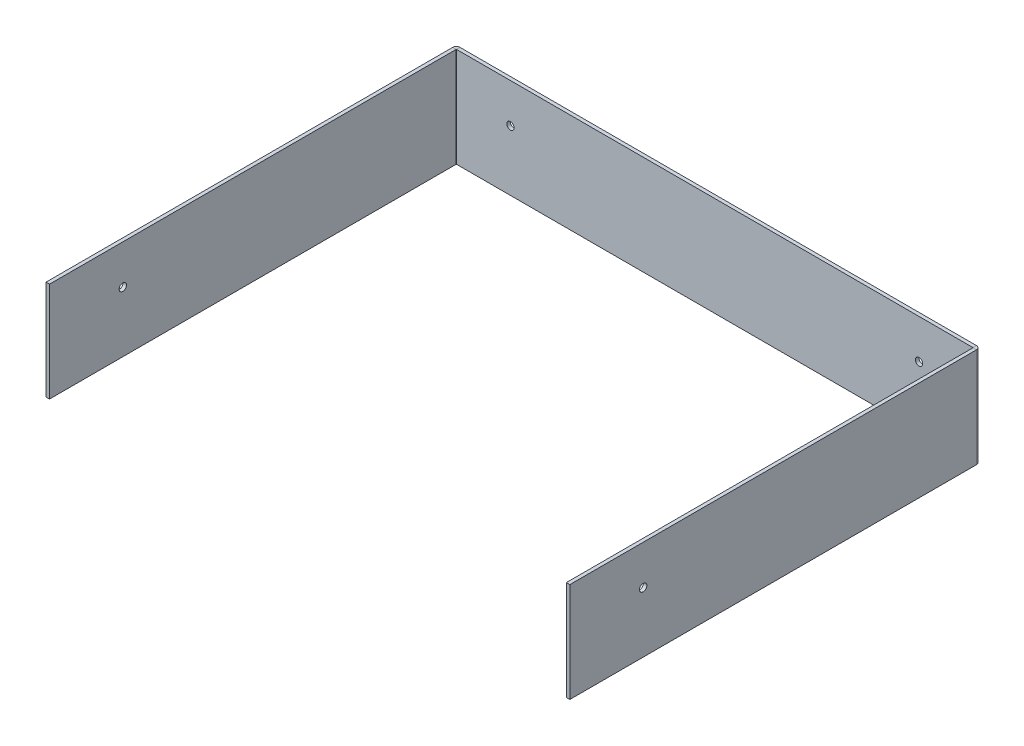
ISO-10303-21;
HEADER;
FILE_DESCRIPTION(('STEP AP214'),'2;1');
FILE_NAME('part.step','',(''),(''),'','','');
FILE_SCHEMA(('AUTOMOTIVE_DESIGN { 1 0 10303 214 1 1 1 1 }'));
ENDSEC;
DATA;
#1=APPLICATION_CONTEXT('core data for automotive mechanical design processes');
#2=APPLICATION_PROTOCOL_DEFINITION('international standard','automotive_design',2000,#1);
#3=PRODUCT_CONTEXT('',#1,'mechanical');
#4=PRODUCT('Part','Part','',(#3));
#5=PRODUCT_RELATED_PRODUCT_CATEGORY('part','',(#4));
#6=PRODUCT_DEFINITION_FORMATION('','',#4);
#7=PRODUCT_DEFINITION_CONTEXT('part definition',#1,'design');
#8=PRODUCT_DEFINITION('design','',#6,#7);
#9=PRODUCT_DEFINITION_SHAPE('','',#8);
#10=(LENGTH_UNIT() NAMED_UNIT(*) SI_UNIT(.MILLI.,.METRE.));
#11=(NAMED_UNIT(*) PLANE_ANGLE_UNIT() SI_UNIT($,.RADIAN.));
#12=(NAMED_UNIT(*) SI_UNIT($,.STERADIAN.) SOLID_ANGLE_UNIT());
#13=UNCERTAINTY_MEASURE_WITH_UNIT(LENGTH_MEASURE(1.E-05),#10,'distance_accuracy_value','');
#14=(GEOMETRIC_REPRESENTATION_CONTEXT(3) GLOBAL_UNCERTAINTY_ASSIGNED_CONTEXT((#13)) GLOBAL_UNIT_ASSIGNED_CONTEXT((#10,
#11,#12)) REPRESENTATION_CONTEXT('',''));
#15=CARTESIAN_POINT('',(0.,0.,0.));
#16=DIRECTION('',(0.,0.,1.));
#17=DIRECTION('',(1.,0.,0.));
#18=AXIS2_PLACEMENT_3D('',#15,#16,#17);
#19=CARTESIAN_POINT('',(-150.,-28.5,-2.));
#20=DIRECTION('',(0.,0.,1.));
#21=DIRECTION('',(1.,0.,0.));
#22=AXIS2_PLACEMENT_3D('',#19,#20,#21);
#23=PLANE('',#22);
#24=CARTESIAN_POINT('',(117.,6.00000000000002,-2.));
#25=DIRECTION('',(0.,0.,1.));
#26=DIRECTION('',(1.,0.,0.));
#27=AXIS2_PLACEMENT_3D('',#24,#25,#26);
#28=CIRCLE('',#27,2.1);
#29=CARTESIAN_POINT('',(119.1,6.00000000000002,-2.));
#30=VERTEX_POINT('',#29);
#31=EDGE_CURVE('E291',#30,#30,#28,.T.);
#32=ORIENTED_EDGE('',*,*,#31,.T.);
#33=EDGE_LOOP('',(#32));
#34=FACE_BOUND('',#33,.T.);
#35=CARTESIAN_POINT('',(-117.,5.99999999999999,-2.));
#36=DIRECTION('',(0.,0.,1.));
#37=DIRECTION('',(1.,0.,0.));
#38=AXIS2_PLACEMENT_3D('',#35,#36,#37);
#39=CIRCLE('',#38,2.1);
#40=CARTESIAN_POINT('',(-114.9,5.99999999999999,-2.));
#41=VERTEX_POINT('',#40);
#42=EDGE_CURVE('E297',#41,#41,#39,.T.);
#43=ORIENTED_EDGE('',*,*,#42,.T.);
#44=EDGE_LOOP('',(#43));
#45=FACE_BOUND('',#44,.T.);
#46=DIRECTION('',(0.,1.,0.));
#47=VECTOR('',#46,1.);
#48=CARTESIAN_POINT('',(147.9,28.5,-2.));
#49=LINE('',#48,#47);
#50=CARTESIAN_POINT('',(147.9,28.5,-2.));
#51=VERTEX_POINT('',#50);
#52=CARTESIAN_POINT('',(147.9,-28.5,-2.));
#53=VERTEX_POINT('',#52);
#54=EDGE_CURVE('E180',#51,#53,#49,.F.);
#55=ORIENTED_EDGE('',*,*,#54,.T.);
#56=DIRECTION('',(1.,0.,0.));
#57=VECTOR('',#56,1.);
#58=CARTESIAN_POINT('',(-150.,-28.5,-2.));
#59=LINE('',#58,#57);
#60=CARTESIAN_POINT('',(-147.9,-28.5,-2.));
#61=VERTEX_POINT('',#60);
#62=EDGE_CURVE('E91',#61,#53,#59,.T.);
#63=ORIENTED_EDGE('',*,*,#62,.F.);
#64=DIRECTION('',(0.,-1.,0.));
#65=VECTOR('',#64,1.);
#66=CARTESIAN_POINT('',(-147.9,-28.5,-2.));
#67=LINE('',#66,#65);
#68=CARTESIAN_POINT('',(-147.9,28.5,-2.));
#69=VERTEX_POINT('',#68);
#70=EDGE_CURVE('E270',#61,#69,#67,.F.);
#71=ORIENTED_EDGE('',*,*,#70,.T.);
#72=DIRECTION('',(-1.,0.,0.));
#73=VECTOR('',#72,1.);
#74=CARTESIAN_POINT('',(-150.,28.5,-2.));
#75=LINE('',#74,#73);
#76=EDGE_CURVE('E13',#51,#69,#75,.T.);
#77=ORIENTED_EDGE('',*,*,#76,.F.);
#78=EDGE_LOOP('',(#55,#63,#71,#77));
#79=FACE_BOUND('',#78,.T.);
#80=ADVANCED_FACE('F82',(#34,#45,#79),#23,.F.);
#81=CARTESIAN_POINT('',(-150.,-28.5,0.));
#82=DIRECTION('',(0.,0.,1.));
#83=DIRECTION('',(1.,0.,0.));
#84=AXIS2_PLACEMENT_3D('',#81,#82,#83);
#85=PLANE('',#84);
#86=CARTESIAN_POINT('',(117.,6.00000000000002,0.));
#87=DIRECTION('',(0.,0.,1.));
#88=DIRECTION('',(1.,0.,0.));
#89=AXIS2_PLACEMENT_3D('',#86,#87,#88);
#90=CIRCLE('',#89,2.1);
#91=CARTESIAN_POINT('',(119.1,6.00000000000002,0.));
#92=VERTEX_POINT('',#91);
#93=EDGE_CURVE('E288',#92,#92,#90,.T.);
#94=ORIENTED_EDGE('',*,*,#93,.F.);
#95=EDGE_LOOP('',(#94));
#96=FACE_BOUND('',#95,.T.);
#97=CARTESIAN_POINT('',(-117.,5.99999999999999,0.));
#98=DIRECTION('',(0.,0.,1.));
#99=DIRECTION('',(1.,0.,0.));
#100=AXIS2_PLACEMENT_3D('',#97,#98,#99);
#101=CIRCLE('',#100,2.1);
#102=CARTESIAN_POINT('',(-114.9,5.99999999999999,0.));
#103=VERTEX_POINT('',#102);
#104=EDGE_CURVE('E294',#103,#103,#101,.T.);
#105=ORIENTED_EDGE('',*,*,#104,.F.);
#106=EDGE_LOOP('',(#105));
#107=FACE_BOUND('',#106,.T.);
#108=DIRECTION('',(1.,0.,0.));
#109=VECTOR('',#108,1.);
#110=CARTESIAN_POINT('',(-150.,-28.5,0.));
#111=LINE('',#110,#109);
#112=CARTESIAN_POINT('',(-147.9,-28.5,0.));
#113=VERTEX_POINT('',#112);
#114=CARTESIAN_POINT('',(147.9,-28.5,0.));
#115=VERTEX_POINT('',#114);
#116=EDGE_CURVE('E300',#113,#115,#111,.T.);
#117=ORIENTED_EDGE('',*,*,#116,.T.);
#118=DIRECTION('',(0.,1.,0.));
#119=VECTOR('',#118,1.);
#120=CARTESIAN_POINT('',(147.9,28.5,0.));
#121=LINE('',#120,#119);
#122=CARTESIAN_POINT('',(147.9,28.5,0.));
#123=VERTEX_POINT('',#122);
#124=EDGE_CURVE('E231',#123,#115,#121,.F.);
#125=ORIENTED_EDGE('',*,*,#124,.F.);
#126=DIRECTION('',(-1.,0.,0.));
#127=VECTOR('',#126,1.);
#128=CARTESIAN_POINT('',(-150.,28.5,0.));
#129=LINE('',#128,#127);
#130=CARTESIAN_POINT('',(-147.9,28.5,0.));
#131=VERTEX_POINT('',#130);
#132=EDGE_CURVE('E304',#123,#131,#129,.T.);
#133=ORIENTED_EDGE('',*,*,#132,.T.);
#134=DIRECTION('',(0.,-1.,0.));
#135=VECTOR('',#134,1.);
#136=CARTESIAN_POINT('',(-147.9,-28.5,0.));
#137=LINE('',#136,#135);
#138=EDGE_CURVE('E99',#113,#131,#137,.F.);
#139=ORIENTED_EDGE('',*,*,#138,.F.);
#140=EDGE_LOOP('',(#117,#125,#133,#139));
#141=FACE_BOUND('',#140,.T.);
#142=ADVANCED_FACE('F307',(#96,#107,#141),#85,.T.);
#143=CARTESIAN_POINT('',(-150.,28.5,-2.));
#144=DIRECTION('',(0.,1.,0.));
#145=DIRECTION('',(-1.,0.,0.));
#146=AXIS2_PLACEMENT_3D('',#143,#144,#145);
#147=PLANE('',#146);
#148=ORIENTED_EDGE('',*,*,#132,.F.);
#149=DIRECTION('',(0.,0.,-1.));
#150=VECTOR('',#149,1.);
#151=CARTESIAN_POINT('',(147.9,28.5,0.));
#152=LINE('',#151,#150);
#153=EDGE_CURVE('E227',#123,#51,#152,.T.);
#154=ORIENTED_EDGE('',*,*,#153,.T.);
#155=ORIENTED_EDGE('',*,*,#76,.T.);
#156=DIRECTION('',(0.,1.3877787807816E-13,-1.));
#157=VECTOR('',#156,1.);
#158=CARTESIAN_POINT('',(-147.9,28.5,0.));
#159=LINE('',#158,#157);
#160=EDGE_CURVE('E285',#131,#69,#159,.T.);
#161=ORIENTED_EDGE('',*,*,#160,.F.);
#162=EDGE_LOOP('',(#148,#154,#155,#161));
#163=FACE_BOUND('',#162,.T.);
#164=ADVANCED_FACE('F308',(#163),#147,.T.);
#165=CARTESIAN_POINT('',(-150.,-28.5,-2.));
#166=DIRECTION('',(0.,-1.,0.));
#167=DIRECTION('',(1.,0.,0.));
#168=AXIS2_PLACEMENT_3D('',#165,#166,#167);
#169=PLANE('',#168);
#170=DIRECTION('',(0.,-1.3877787807816E-13,-1.));
#171=VECTOR('',#170,1.);
#172=CARTESIAN_POINT('',(147.9,-28.5,0.));
#173=LINE('',#172,#171);
#174=EDGE_CURVE('E235',#115,#53,#173,.T.);
#175=ORIENTED_EDGE('',*,*,#174,.F.);
#176=ORIENTED_EDGE('',*,*,#116,.F.);
#177=DIRECTION('',(0.,0.,-1.));
#178=VECTOR('',#177,1.);
#179=CARTESIAN_POINT('',(-147.9,-28.5,0.));
#180=LINE('',#179,#178);
#181=EDGE_CURVE('E276',#113,#61,#180,.T.);
#182=ORIENTED_EDGE('',*,*,#181,.T.);
#183=ORIENTED_EDGE('',*,*,#62,.T.);
#184=EDGE_LOOP('',(#175,#176,#182,#183));
#185=FACE_BOUND('',#184,.T.);
#186=ADVANCED_FACE('F84',(#185),#169,.T.);
#187=CARTESIAN_POINT('',(-117.,5.99999999999999,-2.));
#188=DIRECTION('',(0.,0.,1.));
#189=DIRECTION('',(1.,0.,0.));
#190=AXIS2_PLACEMENT_3D('',#187,#188,#189);
#191=CYLINDRICAL_SURFACE('',#190,2.1);
#192=ORIENTED_EDGE('',*,*,#42,.F.);
#193=EDGE_LOOP('',(#192));
#194=FACE_BOUND('',#193,.T.);
#195=ORIENTED_EDGE('',*,*,#104,.T.);
#196=EDGE_LOOP('',(#195));
#197=FACE_BOUND('',#196,.T.);
#198=ADVANCED_FACE('F361',(#194,#197),#191,.F.);
#199=CARTESIAN_POINT('',(117.,6.00000000000002,-2.));
#200=DIRECTION('',(0.,0.,1.));
#201=DIRECTION('',(1.,0.,0.));
#202=AXIS2_PLACEMENT_3D('',#199,#200,#201);
#203=CYLINDRICAL_SURFACE('',#202,2.1);
#204=ORIENTED_EDGE('',*,*,#31,.F.);
#205=EDGE_LOOP('',(#204));
#206=FACE_BOUND('',#205,.T.);
#207=ORIENTED_EDGE('',*,*,#93,.T.);
#208=EDGE_LOOP('',(#207));
#209=FACE_BOUND('',#208,.T.);
#210=ADVANCED_FACE('F371',(#206,#209),#203,.F.);
#211=CARTESIAN_POINT('',(-147.9,28.5,0.0999999999999893));
#212=DIRECTION('',(0.,1.,0.));
#213=DIRECTION('',(0.,0.,1.));
#214=AXIS2_PLACEMENT_3D('',#211,#212,#213);
#215=PLANE('',#214);
#216=DIRECTION('',(1.,0.,0.));
#217=VECTOR('',#216,1.);
#218=CARTESIAN_POINT('',(-150.,28.5,0.099999999999982));
#219=LINE('',#218,#217);
#220=CARTESIAN_POINT('',(-148.,28.5,0.099999999999989));
#221=VERTEX_POINT('',#220);
#222=CARTESIAN_POINT('',(-150.,28.4999999999999,0.0999999999999821));
#223=VERTEX_POINT('',#222);
#224=EDGE_CURVE('E238',#221,#223,#219,.F.);
#225=ORIENTED_EDGE('',*,*,#224,.F.);
#226=CARTESIAN_POINT('',(-147.9,28.5,0.0999999999999893));
#227=DIRECTION('',(0.,-1.,0.));
#228=DIRECTION('',(0.,0.,-1.));
#229=AXIS2_PLACEMENT_3D('',#226,#227,#228);
#230=CIRCLE('',#229,0.099999999999989);
#231=EDGE_CURVE('E279',#131,#221,#230,.F.);
#232=ORIENTED_EDGE('',*,*,#231,.F.);
#233=ORIENTED_EDGE('',*,*,#160,.T.);
#234=CARTESIAN_POINT('',(-147.9,28.4999999999999,0.0999999999999893));
#235=DIRECTION('',(0.,-1.,0.));
#236=DIRECTION('',(0.,0.,-1.));
#237=AXIS2_PLACEMENT_3D('',#234,#235,#236);
#238=CIRCLE('',#237,2.09999999999999);
#239=EDGE_CURVE('E272',#69,#223,#238,.F.);
#240=ORIENTED_EDGE('',*,*,#239,.T.);
#241=EDGE_LOOP('',(#225,#232,#233,#240));
#242=FACE_BOUND('',#241,.T.);
#243=ADVANCED_FACE('F316',(#242),#215,.T.);
#244=CARTESIAN_POINT('',(-147.9,-28.5,0.0999999999999893));
#245=DIRECTION('',(0.,1.,0.));
#246=DIRECTION('',(0.,0.,1.));
#247=AXIS2_PLACEMENT_3D('',#244,#245,#246);
#248=PLANE('',#247);
#249=CARTESIAN_POINT('',(-147.9,-28.5,0.0999999999999893));
#250=DIRECTION('',(0.,-1.,0.));
#251=DIRECTION('',(0.,0.,-1.));
#252=AXIS2_PLACEMENT_3D('',#249,#250,#251);
#253=CIRCLE('',#252,0.099999999999989);
#254=CARTESIAN_POINT('',(-148.,-28.5,0.099999999999989));
#255=VERTEX_POINT('',#254);
#256=EDGE_CURVE('E243',#255,#113,#253,.T.);
#257=ORIENTED_EDGE('',*,*,#256,.F.);
#258=DIRECTION('',(1.,0.,0.));
#259=VECTOR('',#258,1.);
#260=CARTESIAN_POINT('',(-148.,-28.5,0.099999999999989));
#261=LINE('',#260,#259);
#262=CARTESIAN_POINT('',(-150.,-28.5,0.099999999999982));
#263=VERTEX_POINT('',#262);
#264=EDGE_CURVE('E263',#255,#263,#261,.F.);
#265=ORIENTED_EDGE('',*,*,#264,.T.);
#266=CARTESIAN_POINT('',(-147.9,-28.5,0.0999999999999893));
#267=DIRECTION('',(0.,-1.,0.));
#268=DIRECTION('',(0.,0.,-1.));
#269=AXIS2_PLACEMENT_3D('',#266,#267,#268);
#270=CIRCLE('',#269,2.09999999999999);
#271=EDGE_CURVE('E273',#263,#61,#270,.T.);
#272=ORIENTED_EDGE('',*,*,#271,.T.);
#273=ORIENTED_EDGE('',*,*,#181,.F.);
#274=EDGE_LOOP('',(#257,#265,#272,#273));
#275=FACE_BOUND('',#274,.T.);
#276=ADVANCED_FACE('F337',(#275),#248,.F.);
#277=CARTESIAN_POINT('',(-147.9,-28.5,0.0999999999999893));
#278=DIRECTION('',(0.,-1.,0.));
#279=DIRECTION('',(-1.,0.,0.));
#280=AXIS2_PLACEMENT_3D('',#277,#278,#279);
#281=CYLINDRICAL_SURFACE('',#280,2.09999999999999);
#282=ORIENTED_EDGE('',*,*,#70,.F.);
#283=ORIENTED_EDGE('',*,*,#271,.F.);
#284=DIRECTION('',(0.,-1.,0.));
#285=VECTOR('',#284,1.);
#286=CARTESIAN_POINT('',(-150.,28.5,0.099999999999982));
#287=LINE('',#286,#285);
#288=EDGE_CURVE('E261',#263,#223,#287,.F.);
#289=ORIENTED_EDGE('',*,*,#288,.T.);
#290=ORIENTED_EDGE('',*,*,#239,.F.);
#291=EDGE_LOOP('',(#282,#283,#289,#290));
#292=FACE_BOUND('',#291,.T.);
#293=ADVANCED_FACE('F347',(#292),#281,.T.);
#294=CARTESIAN_POINT('',(-147.9,-28.5,0.0999999999999893));
#295=DIRECTION('',(0.,-1.,0.));
#296=DIRECTION('',(-1.,0.,0.));
#297=AXIS2_PLACEMENT_3D('',#294,#295,#296);
#298=CYLINDRICAL_SURFACE('',#297,0.099999999999989);
#299=ORIENTED_EDGE('',*,*,#138,.T.);
#300=ORIENTED_EDGE('',*,*,#231,.T.);
#301=DIRECTION('',(0.,-1.,0.));
#302=VECTOR('',#301,1.);
#303=CARTESIAN_POINT('',(-148.,28.5,0.099999999999989));
#304=LINE('',#303,#302);
#305=EDGE_CURVE('E266',#221,#255,#304,.T.);
#306=ORIENTED_EDGE('',*,*,#305,.T.);
#307=ORIENTED_EDGE('',*,*,#256,.T.);
#308=EDGE_LOOP('',(#299,#300,#306,#307));
#309=FACE_BOUND('',#308,.T.);
#310=ADVANCED_FACE('F313',(#309),#298,.F.);
#311=CARTESIAN_POINT('',(-150.000000000001,-28.5,233.));
#312=DIRECTION('',(0.,1.,0.));
#313=DIRECTION('',(0.,0.,1.));
#314=AXIS2_PLACEMENT_3D('',#311,#312,#313);
#315=PLANE('',#314);
#316=ORIENTED_EDGE('',*,*,#264,.F.);
#317=DIRECTION('',(0.,0.,-1.));
#318=VECTOR('',#317,1.);
#319=CARTESIAN_POINT('',(-148.000000000001,-28.5,233.));
#320=LINE('',#319,#318);
#321=CARTESIAN_POINT('',(-148.000000000001,-28.5,233.));
#322=VERTEX_POINT('',#321);
#323=EDGE_CURVE('E259',#255,#322,#320,.F.);
#324=ORIENTED_EDGE('',*,*,#323,.T.);
#325=DIRECTION('',(1.,0.,0.));
#326=VECTOR('',#325,1.);
#327=CARTESIAN_POINT('',(-150.000000000001,-28.5,233.));
#328=LINE('',#327,#326);
#329=CARTESIAN_POINT('',(-150.000000000001,-28.5,233.));
#330=VERTEX_POINT('',#329);
#331=EDGE_CURVE('E240',#330,#322,#328,.T.);
#332=ORIENTED_EDGE('',*,*,#331,.F.);
#333=DIRECTION('',(0.,0.,1.));
#334=VECTOR('',#333,1.);
#335=CARTESIAN_POINT('',(-150.,-28.5,0.));
#336=LINE('',#335,#334);
#337=EDGE_CURVE('E252',#263,#330,#336,.T.);
#338=ORIENTED_EDGE('',*,*,#337,.F.);
#339=EDGE_LOOP('',(#316,#324,#332,#338));
#340=FACE_BOUND('',#339,.T.);
#341=ADVANCED_FACE('F339',(#340),#315,.F.);
#342=CARTESIAN_POINT('',(-150.,28.5,0.));
#343=DIRECTION('',(0.,-1.,0.));
#344=DIRECTION('',(0.,0.,-1.));
#345=AXIS2_PLACEMENT_3D('',#342,#343,#344);
#346=PLANE('',#345);
#347=ORIENTED_EDGE('',*,*,#224,.T.);
#348=DIRECTION('',(0.,0.,-1.));
#349=VECTOR('',#348,1.);
#350=CARTESIAN_POINT('',(-150.,28.5,0.));
#351=LINE('',#350,#349);
#352=CARTESIAN_POINT('',(-150.000000000001,28.5,233.));
#353=VERTEX_POINT('',#352);
#354=EDGE_CURVE('E247',#353,#223,#351,.T.);
#355=ORIENTED_EDGE('',*,*,#354,.F.);
#356=DIRECTION('',(1.,0.,0.));
#357=VECTOR('',#356,1.);
#358=CARTESIAN_POINT('',(-150.000000000001,28.5,233.));
#359=LINE('',#358,#357);
#360=CARTESIAN_POINT('',(-148.000000000001,28.5,233.));
#361=VERTEX_POINT('',#360);
#362=EDGE_CURVE('E244',#353,#361,#359,.T.);
#363=ORIENTED_EDGE('',*,*,#362,.T.);
#364=DIRECTION('',(0.,0.,1.));
#365=VECTOR('',#364,1.);
#366=CARTESIAN_POINT('',(-148.,28.5,0.));
#367=LINE('',#366,#365);
#368=EDGE_CURVE('E254',#361,#221,#367,.F.);
#369=ORIENTED_EDGE('',*,*,#368,.T.);
#370=EDGE_LOOP('',(#347,#355,#363,#369));
#371=FACE_BOUND('',#370,.T.);
#372=ADVANCED_FACE('F319',(#371),#346,.F.);
#373=CARTESIAN_POINT('',(-150.,-28.5,0.));
#374=DIRECTION('',(1.,0.,0.));
#375=DIRECTION('',(0.,0.,-1.));
#376=AXIS2_PLACEMENT_3D('',#373,#374,#375);
#377=PLANE('',#376);
#378=CARTESIAN_POINT('',(-150.000000000001,6.00000000000001,191.000000000001));
#379=DIRECTION('',(1.,0.,0.));
#380=DIRECTION('',(0.,0.,-1.));
#381=AXIS2_PLACEMENT_3D('',#378,#379,#380);
#382=CIRCLE('',#381,2.09999999999999);
#383=CARTESIAN_POINT('',(-150.000000000001,6.00000000000001,188.900000000001));
#384=VERTEX_POINT('',#383);
#385=EDGE_CURVE('E398',#384,#384,#382,.T.);
#386=ORIENTED_EDGE('',*,*,#385,.T.);
#387=EDGE_LOOP('',(#386));
#388=FACE_BOUND('',#387,.T.);
#389=ORIENTED_EDGE('',*,*,#288,.F.);
#390=ORIENTED_EDGE('',*,*,#337,.T.);
#391=DIRECTION('',(0.,1.,0.));
#392=VECTOR('',#391,1.);
#393=CARTESIAN_POINT('',(-150.000000000001,-28.5,233.));
#394=LINE('',#393,#392);
#395=EDGE_CURVE('E250',#330,#353,#394,.T.);
#396=ORIENTED_EDGE('',*,*,#395,.T.);
#397=ORIENTED_EDGE('',*,*,#354,.T.);
#398=EDGE_LOOP('',(#389,#390,#396,#397));
#399=FACE_BOUND('',#398,.T.);
#400=ADVANCED_FACE('F323',(#388,#399),#377,.F.);
#401=CARTESIAN_POINT('',(-148.,-28.5,0.));
#402=DIRECTION('',(1.,0.,0.));
#403=DIRECTION('',(0.,0.,-1.));
#404=AXIS2_PLACEMENT_3D('',#401,#402,#403);
#405=PLANE('',#404);
#406=CARTESIAN_POINT('',(-148.000000000001,6.00000000000001,191.000000000001));
#407=DIRECTION('',(1.,0.,0.));
#408=DIRECTION('',(0.,0.,-1.));
#409=AXIS2_PLACEMENT_3D('',#406,#407,#408);
#410=CIRCLE('',#409,2.09999999999999);
#411=CARTESIAN_POINT('',(-148.000000000001,6.00000000000001,188.900000000001));
#412=VERTEX_POINT('',#411);
#413=EDGE_CURVE('E224',#412,#412,#410,.T.);
#414=ORIENTED_EDGE('',*,*,#413,.F.);
#415=EDGE_LOOP('',(#414));
#416=FACE_BOUND('',#415,.T.);
#417=ORIENTED_EDGE('',*,*,#323,.F.);
#418=ORIENTED_EDGE('',*,*,#305,.F.);
#419=ORIENTED_EDGE('',*,*,#368,.F.);
#420=DIRECTION('',(0.,-1.,0.));
#421=VECTOR('',#420,1.);
#422=CARTESIAN_POINT('',(-148.000000000001,28.5,233.));
#423=LINE('',#422,#421);
#424=EDGE_CURVE('E257',#322,#361,#423,.F.);
#425=ORIENTED_EDGE('',*,*,#424,.F.);
#426=EDGE_LOOP('',(#417,#418,#419,#425));
#427=FACE_BOUND('',#426,.T.);
#428=ADVANCED_FACE('F333',(#416,#427),#405,.T.);
#429=CARTESIAN_POINT('',(-150.000000000001,28.5,233.));
#430=DIRECTION('',(0.,0.,-1.));
#431=DIRECTION('',(-1.,0.,0.));
#432=AXIS2_PLACEMENT_3D('',#429,#430,#431);
#433=PLANE('',#432);
#434=ORIENTED_EDGE('',*,*,#424,.T.);
#435=ORIENTED_EDGE('',*,*,#362,.F.);
#436=ORIENTED_EDGE('',*,*,#395,.F.);
#437=ORIENTED_EDGE('',*,*,#331,.T.);
#438=EDGE_LOOP('',(#434,#435,#436,#437));
#439=FACE_BOUND('',#438,.T.);
#440=ADVANCED_FACE('F329',(#439),#433,.F.);
#441=CARTESIAN_POINT('',(147.9,-28.5,0.0999999999999893));
#442=DIRECTION('',(0.,-1.,0.));
#443=DIRECTION('',(0.,0.,-1.));
#444=AXIS2_PLACEMENT_3D('',#441,#442,#443);
#445=PLANE('',#444);
#446=DIRECTION('',(-1.,0.,0.));
#447=VECTOR('',#446,1.);
#448=CARTESIAN_POINT('',(150.,-28.5,0.099999999999989));
#449=LINE('',#448,#447);
#450=CARTESIAN_POINT('',(148.,-28.5,0.099999999999989));
#451=VERTEX_POINT('',#450);
#452=CARTESIAN_POINT('',(150.,-28.5,0.0999999999999821));
#453=VERTEX_POINT('',#452);
#454=EDGE_CURVE('E221',#451,#453,#449,.F.);
#455=ORIENTED_EDGE('',*,*,#454,.F.);
#456=CARTESIAN_POINT('',(147.9,-28.5,0.0999999999999893));
#457=DIRECTION('',(0.,1.,0.));
#458=DIRECTION('',(0.,0.,1.));
#459=AXIS2_PLACEMENT_3D('',#456,#457,#458);
#460=CIRCLE('',#459,0.099999999999989);
#461=EDGE_CURVE('E183',#115,#451,#460,.F.);
#462=ORIENTED_EDGE('',*,*,#461,.F.);
#463=ORIENTED_EDGE('',*,*,#174,.T.);
#464=CARTESIAN_POINT('',(147.9,-28.5,0.0999999999999893));
#465=DIRECTION('',(0.,1.,0.));
#466=DIRECTION('',(0.,0.,1.));
#467=AXIS2_PLACEMENT_3D('',#464,#465,#466);
#468=CIRCLE('',#467,2.09999999999999);
#469=EDGE_CURVE('E226',#53,#453,#468,.F.);
#470=ORIENTED_EDGE('',*,*,#469,.T.);
#471=EDGE_LOOP('',(#455,#462,#463,#470));
#472=FACE_BOUND('',#471,.T.);
#473=ADVANCED_FACE('F378',(#472),#445,.T.);
#474=CARTESIAN_POINT('',(147.9,28.5,0.0999999999999893));
#475=DIRECTION('',(0.,-1.,0.));
#476=DIRECTION('',(0.,0.,-1.));
#477=AXIS2_PLACEMENT_3D('',#474,#475,#476);
#478=PLANE('',#477);
#479=CARTESIAN_POINT('',(147.9,28.5,0.0999999999999893));
#480=DIRECTION('',(0.,1.,0.));
#481=DIRECTION('',(0.,0.,1.));
#482=AXIS2_PLACEMENT_3D('',#479,#480,#481);
#483=CIRCLE('',#482,0.099999999999989);
#484=CARTESIAN_POINT('',(148.,28.5,0.099999999999989));
#485=VERTEX_POINT('',#484);
#486=EDGE_CURVE('E190',#485,#123,#483,.T.);
#487=ORIENTED_EDGE('',*,*,#486,.F.);
#488=DIRECTION('',(-1.,0.,0.));
#489=VECTOR('',#488,1.);
#490=CARTESIAN_POINT('',(148.,28.5,0.099999999999989));
#491=LINE('',#490,#489);
#492=CARTESIAN_POINT('',(150.,28.5,0.099999999999982));
#493=VERTEX_POINT('',#492);
#494=EDGE_CURVE('E187',#485,#493,#491,.F.);
#495=ORIENTED_EDGE('',*,*,#494,.T.);
#496=CARTESIAN_POINT('',(147.9,28.5,0.0999999999999893));
#497=DIRECTION('',(0.,1.,0.));
#498=DIRECTION('',(0.,0.,1.));
#499=AXIS2_PLACEMENT_3D('',#496,#497,#498);
#500=CIRCLE('',#499,2.09999999999999);
#501=EDGE_CURVE('E173',#493,#51,#500,.T.);
#502=ORIENTED_EDGE('',*,*,#501,.T.);
#503=ORIENTED_EDGE('',*,*,#153,.F.);
#504=EDGE_LOOP('',(#487,#495,#502,#503));
#505=FACE_BOUND('',#504,.T.);
#506=ADVANCED_FACE('F188',(#505),#478,.F.);
#507=CARTESIAN_POINT('',(147.9,28.5,0.0999999999999893));
#508=DIRECTION('',(0.,1.,0.));
#509=DIRECTION('',(1.,0.,0.));
#510=AXIS2_PLACEMENT_3D('',#507,#508,#509);
#511=CYLINDRICAL_SURFACE('',#510,2.09999999999999);
#512=ORIENTED_EDGE('',*,*,#54,.F.);
#513=ORIENTED_EDGE('',*,*,#501,.F.);
#514=DIRECTION('',(0.,1.,0.));
#515=VECTOR('',#514,1.);
#516=CARTESIAN_POINT('',(150.,28.5,0.099999999999982));
#517=LINE('',#516,#515);
#518=EDGE_CURVE('E178',#453,#493,#517,.T.);
#519=ORIENTED_EDGE('',*,*,#518,.F.);
#520=ORIENTED_EDGE('',*,*,#469,.F.);
#521=EDGE_LOOP('',(#512,#513,#519,#520));
#522=FACE_BOUND('',#521,.T.);
#523=ADVANCED_FACE('F175',(#522),#511,.T.);
#524=CARTESIAN_POINT('',(147.9,28.5,0.0999999999999893));
#525=DIRECTION('',(0.,1.,0.));
#526=DIRECTION('',(1.,0.,0.));
#527=AXIS2_PLACEMENT_3D('',#524,#525,#526);
#528=CYLINDRICAL_SURFACE('',#527,0.099999999999989);
#529=ORIENTED_EDGE('',*,*,#124,.T.);
#530=ORIENTED_EDGE('',*,*,#461,.T.);
#531=DIRECTION('',(0.,-1.,0.));
#532=VECTOR('',#531,1.);
#533=CARTESIAN_POINT('',(148.,-28.5,0.099999999999989));
#534=LINE('',#533,#532);
#535=EDGE_CURVE('E194',#451,#485,#534,.F.);
#536=ORIENTED_EDGE('',*,*,#535,.T.);
#537=ORIENTED_EDGE('',*,*,#486,.T.);
#538=EDGE_LOOP('',(#529,#530,#536,#537));
#539=FACE_BOUND('',#538,.T.);
#540=ADVANCED_FACE('F376',(#539),#528,.F.);
#541=CARTESIAN_POINT('',(150.,28.5,0.));
#542=DIRECTION('',(0.,-1.,0.));
#543=DIRECTION('',(0.,0.,-1.));
#544=AXIS2_PLACEMENT_3D('',#541,#542,#543);
#545=PLANE('',#544);
#546=ORIENTED_EDGE('',*,*,#494,.F.);
#547=DIRECTION('',(0.,0.,1.));
#548=VECTOR('',#547,1.);
#549=CARTESIAN_POINT('',(148.,28.5,0.));
#550=LINE('',#549,#548);
#551=CARTESIAN_POINT('',(148.000000000001,28.5,233.));
#552=VERTEX_POINT('',#551);
#553=EDGE_CURVE('E203',#485,#552,#550,.T.);
#554=ORIENTED_EDGE('',*,*,#553,.T.);
#555=DIRECTION('',(-1.,0.,0.));
#556=VECTOR('',#555,1.);
#557=CARTESIAN_POINT('',(150.000000000001,28.5,233.));
#558=LINE('',#557,#556);
#559=CARTESIAN_POINT('',(150.000000000001,28.5,233.));
#560=VERTEX_POINT('',#559);
#561=EDGE_CURVE('E207',#560,#552,#558,.T.);
#562=ORIENTED_EDGE('',*,*,#561,.F.);
#563=DIRECTION('',(0.,0.,-1.));
#564=VECTOR('',#563,1.);
#565=CARTESIAN_POINT('',(150.,28.5,0.));
#566=LINE('',#565,#564);
#567=EDGE_CURVE('E199',#493,#560,#566,.F.);
#568=ORIENTED_EDGE('',*,*,#567,.F.);
#569=EDGE_LOOP('',(#546,#554,#562,#568));
#570=FACE_BOUND('',#569,.T.);
#571=ADVANCED_FACE('F205',(#570),#545,.F.);
#572=CARTESIAN_POINT('',(150.000000000001,-28.5,233.));
#573=DIRECTION('',(0.,1.,0.));
#574=DIRECTION('',(0.,0.,1.));
#575=AXIS2_PLACEMENT_3D('',#572,#573,#574);
#576=PLANE('',#575);
#577=ORIENTED_EDGE('',*,*,#454,.T.);
#578=DIRECTION('',(0.,0.,1.));
#579=VECTOR('',#578,1.);
#580=CARTESIAN_POINT('',(150.,-28.5,0.));
#581=LINE('',#580,#579);
#582=CARTESIAN_POINT('',(150.000000000001,-28.5,233.));
#583=VERTEX_POINT('',#582);
#584=EDGE_CURVE('E202',#583,#453,#581,.F.);
#585=ORIENTED_EDGE('',*,*,#584,.F.);
#586=DIRECTION('',(-1.,0.,0.));
#587=VECTOR('',#586,1.);
#588=CARTESIAN_POINT('',(150.000000000001,-28.5,233.));
#589=LINE('',#588,#587);
#590=CARTESIAN_POINT('',(148.000000000001,-28.5,233.));
#591=VERTEX_POINT('',#590);
#592=EDGE_CURVE('E384',#583,#591,#589,.T.);
#593=ORIENTED_EDGE('',*,*,#592,.T.);
#594=DIRECTION('',(0.,0.,-1.));
#595=VECTOR('',#594,1.);
#596=CARTESIAN_POINT('',(148.000000000001,-28.5,233.));
#597=LINE('',#596,#595);
#598=EDGE_CURVE('E210',#591,#451,#597,.T.);
#599=ORIENTED_EDGE('',*,*,#598,.T.);
#600=EDGE_LOOP('',(#577,#585,#593,#599));
#601=FACE_BOUND('',#600,.T.);
#602=ADVANCED_FACE('F380',(#601),#576,.F.);
#603=CARTESIAN_POINT('',(150.,28.5,0.));
#604=DIRECTION('',(1.,0.,0.));
#605=DIRECTION('',(0.,0.,-1.));
#606=AXIS2_PLACEMENT_3D('',#603,#604,#605);
#607=PLANE('',#606);
#608=CARTESIAN_POINT('',(150.000000000001,6.00000000000001,191.));
#609=DIRECTION('',(1.,0.,0.));
#610=DIRECTION('',(0.,0.,-1.));
#611=AXIS2_PLACEMENT_3D('',#608,#609,#610);
#612=CIRCLE('',#611,2.09999999999999);
#613=CARTESIAN_POINT('',(150.000000000001,6.00000000000001,188.9));
#614=VERTEX_POINT('',#613);
#615=EDGE_CURVE('E395',#614,#614,#612,.T.);
#616=ORIENTED_EDGE('',*,*,#615,.F.);
#617=EDGE_LOOP('',(#616));
#618=FACE_BOUND('',#617,.T.);
#619=ORIENTED_EDGE('',*,*,#584,.T.);
#620=ORIENTED_EDGE('',*,*,#518,.T.);
#621=ORIENTED_EDGE('',*,*,#567,.T.);
#622=DIRECTION('',(0.,1.,0.));
#623=VECTOR('',#622,1.);
#624=CARTESIAN_POINT('',(150.000000000001,28.5,233.));
#625=LINE('',#624,#623);
#626=EDGE_CURVE('E209',#560,#583,#625,.F.);
#627=ORIENTED_EDGE('',*,*,#626,.T.);
#628=EDGE_LOOP('',(#619,#620,#621,#627));
#629=FACE_BOUND('',#628,.T.);
#630=ADVANCED_FACE('F198',(#618,#629),#607,.T.);
#631=CARTESIAN_POINT('',(148.,28.5,0.));
#632=DIRECTION('',(1.,0.,0.));
#633=DIRECTION('',(0.,0.,-1.));
#634=AXIS2_PLACEMENT_3D('',#631,#632,#633);
#635=PLANE('',#634);
#636=CARTESIAN_POINT('',(148.000000000001,6.00000000000001,191.));
#637=DIRECTION('',(1.,0.,0.));
#638=DIRECTION('',(0.,0.,-1.));
#639=AXIS2_PLACEMENT_3D('',#636,#637,#638);
#640=CIRCLE('',#639,2.09999999999999);
#641=CARTESIAN_POINT('',(148.000000000001,6.00000000000001,188.9));
#642=VERTEX_POINT('',#641);
#643=EDGE_CURVE('E86',#642,#642,#640,.T.);
#644=ORIENTED_EDGE('',*,*,#643,.T.);
#645=EDGE_LOOP('',(#644));
#646=FACE_BOUND('',#645,.T.);
#647=ORIENTED_EDGE('',*,*,#535,.F.);
#648=ORIENTED_EDGE('',*,*,#598,.F.);
#649=DIRECTION('',(0.,-1.,0.));
#650=VECTOR('',#649,1.);
#651=CARTESIAN_POINT('',(148.000000000001,28.5,233.));
#652=LINE('',#651,#650);
#653=EDGE_CURVE('E214',#552,#591,#652,.T.);
#654=ORIENTED_EDGE('',*,*,#653,.F.);
#655=ORIENTED_EDGE('',*,*,#553,.F.);
#656=EDGE_LOOP('',(#647,#648,#654,#655));
#657=FACE_BOUND('',#656,.T.);
#658=ADVANCED_FACE('F387',(#646,#657),#635,.F.);
#659=CARTESIAN_POINT('',(150.000000000001,28.5,233.));
#660=DIRECTION('',(0.,0.,-1.));
#661=DIRECTION('',(-1.,0.,0.));
#662=AXIS2_PLACEMENT_3D('',#659,#660,#661);
#663=PLANE('',#662);
#664=ORIENTED_EDGE('',*,*,#653,.T.);
#665=ORIENTED_EDGE('',*,*,#592,.F.);
#666=ORIENTED_EDGE('',*,*,#626,.F.);
#667=ORIENTED_EDGE('',*,*,#561,.T.);
#668=EDGE_LOOP('',(#664,#665,#666,#667));
#669=FACE_BOUND('',#668,.T.);
#670=ADVANCED_FACE('F389',(#669),#663,.F.);
#671=CARTESIAN_POINT('',(-150.000000000001,6.00000000000001,191.000000000001));
#672=DIRECTION('',(1.,0.,0.));
#673=DIRECTION('',(0.,0.,-1.));
#674=AXIS2_PLACEMENT_3D('',#671,#672,#673);
#675=CYLINDRICAL_SURFACE('',#674,2.09999999999999);
#676=ORIENTED_EDGE('',*,*,#615,.T.);
#677=EDGE_LOOP('',(#676));
#678=FACE_BOUND('',#677,.T.);
#679=ORIENTED_EDGE('',*,*,#643,.F.);
#680=EDGE_LOOP('',(#679));
#681=FACE_BOUND('',#680,.T.);
#682=ADVANCED_FACE('F406',(#678,#681),#675,.F.);
#683=ORIENTED_EDGE('',*,*,#413,.T.);
#684=EDGE_LOOP('',(#683));
#685=FACE_BOUND('',#684,.T.);
#686=ORIENTED_EDGE('',*,*,#385,.F.);
#687=EDGE_LOOP('',(#686));
#688=FACE_BOUND('',#687,.T.);
#689=ADVANCED_FACE('F408',(#685,#688),#675,.F.);
#690=CLOSED_SHELL('',(#80,#142,#164,#186,#198,#210,#243,#276,#293,#310,#341,#372,#400,#428,#440,
#473,#506,#523,#540,#571,#602,#630,#658,#670,#682,#689));
#691=MANIFOLD_SOLID_BREP('B2',#690);
#692=ADVANCED_BREP_SHAPE_REPRESENTATION('',(#18,#691),#14);
#693=SHAPE_DEFINITION_REPRESENTATION(#9,#692);
ENDSEC;
END-ISO-10303-21;
